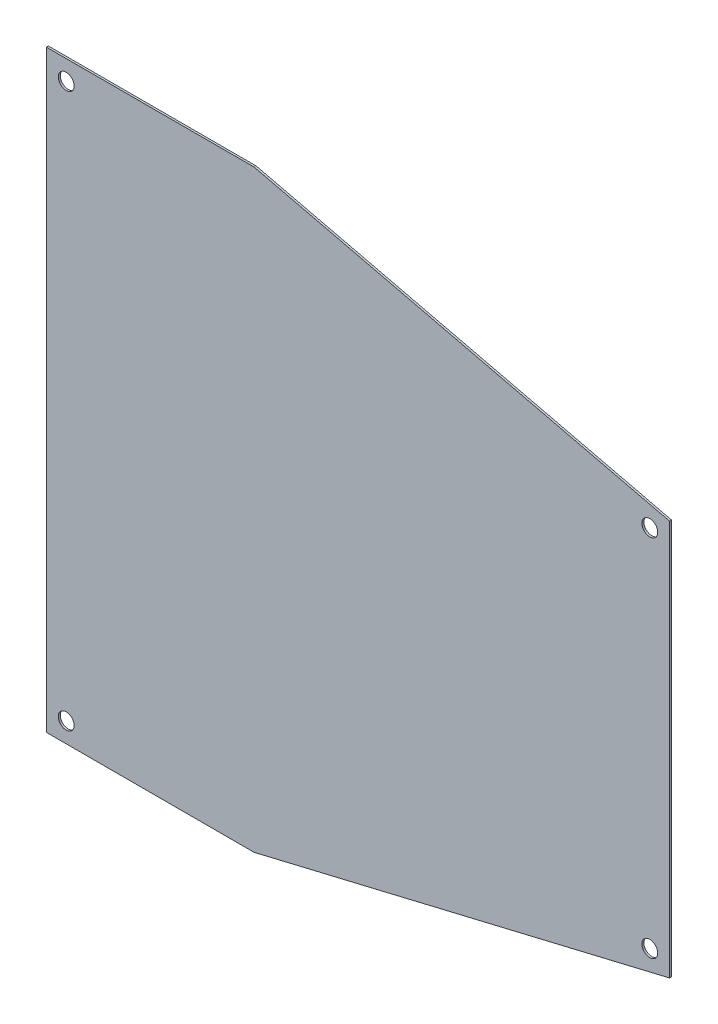
ISO-10303-21;
HEADER;
FILE_DESCRIPTION(('STEP AP214'),'2;1');
FILE_NAME('part.step','',(''),(''),'','','');
FILE_SCHEMA(('AUTOMOTIVE_DESIGN { 1 0 10303 214 1 1 1 1 }'));
ENDSEC;
DATA;
#1=APPLICATION_CONTEXT('core data for automotive mechanical design processes');
#2=APPLICATION_PROTOCOL_DEFINITION('international standard','automotive_design',2000,#1);
#3=PRODUCT_CONTEXT('',#1,'mechanical');
#4=PRODUCT('Part','Part','',(#3));
#5=PRODUCT_RELATED_PRODUCT_CATEGORY('part','',(#4));
#6=PRODUCT_DEFINITION_FORMATION('','',#4);
#7=PRODUCT_DEFINITION_CONTEXT('part definition',#1,'design');
#8=PRODUCT_DEFINITION('design','',#6,#7);
#9=PRODUCT_DEFINITION_SHAPE('','',#8);
#10=(LENGTH_UNIT() NAMED_UNIT(*) SI_UNIT(.MILLI.,.METRE.));
#11=(NAMED_UNIT(*) PLANE_ANGLE_UNIT() SI_UNIT($,.RADIAN.));
#12=(NAMED_UNIT(*) SI_UNIT($,.STERADIAN.) SOLID_ANGLE_UNIT());
#13=UNCERTAINTY_MEASURE_WITH_UNIT(LENGTH_MEASURE(1.E-05),#10,'distance_accuracy_value','');
#14=(GEOMETRIC_REPRESENTATION_CONTEXT(3) GLOBAL_UNCERTAINTY_ASSIGNED_CONTEXT((#13)) GLOBAL_UNIT_ASSIGNED_CONTEXT((#10,
#11,#12)) REPRESENTATION_CONTEXT('',''));
#15=CARTESIAN_POINT('',(0.,0.,0.));
#16=DIRECTION('',(0.,0.,1.));
#17=DIRECTION('',(1.,0.,0.));
#18=AXIS2_PLACEMENT_3D('',#15,#16,#17);
#19=CARTESIAN_POINT('',(210.,0.,0.5));
#20=DIRECTION('',(-1.,0.,0.));
#21=DIRECTION('',(0.,0.,1.));
#22=AXIS2_PLACEMENT_3D('',#19,#20,#21);
#23=PLANE('',#22);
#24=DIRECTION('',(0.,1.,0.));
#25=VECTOR('',#24,1.);
#26=CARTESIAN_POINT('',(210.,0.,0.));
#27=LINE('',#26,#25);
#28=CARTESIAN_POINT('',(210.,-50.,0.));
#29=VERTEX_POINT('',#28);
#30=CARTESIAN_POINT('',(210.,50.,0.));
#31=VERTEX_POINT('',#30);
#32=EDGE_CURVE('E145',#29,#31,#27,.T.);
#33=ORIENTED_EDGE('',*,*,#32,.T.);
#34=DIRECTION('',(0.,0.,-1.));
#35=VECTOR('',#34,1.);
#36=CARTESIAN_POINT('',(210.,50.,0.5));
#37=LINE('',#36,#35);
#38=CARTESIAN_POINT('',(210.,50.,0.5));
#39=VERTEX_POINT('',#38);
#40=EDGE_CURVE('E12',#39,#31,#37,.T.);
#41=ORIENTED_EDGE('',*,*,#40,.F.);
#42=DIRECTION('',(0.,1.,0.));
#43=VECTOR('',#42,1.);
#44=CARTESIAN_POINT('',(210.,0.,0.5));
#45=LINE('',#44,#43);
#46=CARTESIAN_POINT('',(210.,-50.,0.5));
#47=VERTEX_POINT('',#46);
#48=EDGE_CURVE('E169',#47,#39,#45,.T.);
#49=ORIENTED_EDGE('',*,*,#48,.F.);
#50=DIRECTION('',(0.,0.,-1.));
#51=VECTOR('',#50,1.);
#52=CARTESIAN_POINT('',(210.,-50.,0.5));
#53=LINE('',#52,#51);
#54=EDGE_CURVE('E144',#47,#29,#53,.T.);
#55=ORIENTED_EDGE('',*,*,#54,.T.);
#56=EDGE_LOOP('',(#33,#41,#49,#55));
#57=FACE_BOUND('',#56,.T.);
#58=ADVANCED_FACE('F38',(#57),#23,.F.);
#59=CARTESIAN_POINT('',(22.5321888412017,94.6351931330472,0.5));
#60=DIRECTION('',(-0.23162052730604,-0.972806214685367,0.));
#61=DIRECTION('',(0.972806214685367,-0.23162052730604,0.));
#62=AXIS2_PLACEMENT_3D('',#59,#60,#61);
#63=PLANE('',#62);
#64=DIRECTION('',(-0.972806214685367,0.23162052730604,0.));
#65=VECTOR('',#64,1.);
#66=CARTESIAN_POINT('',(22.5321888412017,94.6351931330472,0.));
#67=LINE('',#66,#65);
#68=CARTESIAN_POINT('',(105.,75.,0.));
#69=VERTEX_POINT('',#68);
#70=EDGE_CURVE('E148',#31,#69,#67,.T.);
#71=ORIENTED_EDGE('',*,*,#70,.T.);
#72=DIRECTION('',(0.,0.,-1.));
#73=VECTOR('',#72,1.);
#74=CARTESIAN_POINT('',(105.,75.,0.5));
#75=LINE('',#74,#73);
#76=CARTESIAN_POINT('',(105.,75.,0.5));
#77=VERTEX_POINT('',#76);
#78=EDGE_CURVE('E46',#77,#69,#75,.T.);
#79=ORIENTED_EDGE('',*,*,#78,.F.);
#80=DIRECTION('',(-0.972806214685367,0.23162052730604,0.));
#81=VECTOR('',#80,1.);
#82=CARTESIAN_POINT('',(22.5321888412017,94.6351931330472,0.5));
#83=LINE('',#82,#81);
#84=EDGE_CURVE('E91',#39,#77,#83,.T.);
#85=ORIENTED_EDGE('',*,*,#84,.F.);
#86=ORIENTED_EDGE('',*,*,#40,.T.);
#87=EDGE_LOOP('',(#71,#79,#85,#86));
#88=FACE_BOUND('',#87,.T.);
#89=ADVANCED_FACE('F175',(#88),#63,.F.);
#90=CARTESIAN_POINT('',(0.,75.,0.5));
#91=DIRECTION('',(0.,1.,0.));
#92=DIRECTION('',(0.,0.,1.));
#93=AXIS2_PLACEMENT_3D('',#90,#91,#92);
#94=PLANE('',#93);
#95=DIRECTION('',(1.,0.,0.));
#96=VECTOR('',#95,1.);
#97=CARTESIAN_POINT('',(0.,75.,0.));
#98=LINE('',#97,#96);
#99=CARTESIAN_POINT('',(52.5,75.,0.));
#100=VERTEX_POINT('',#99);
#101=EDGE_CURVE('E151',#100,#69,#98,.T.);
#102=ORIENTED_EDGE('',*,*,#101,.F.);
#103=DIRECTION('',(0.,0.,-1.));
#104=VECTOR('',#103,1.);
#105=CARTESIAN_POINT('',(52.5,75.,0.5));
#106=LINE('',#105,#104);
#107=CARTESIAN_POINT('',(52.5,75.,0.5));
#108=VERTEX_POINT('',#107);
#109=EDGE_CURVE('E114',#108,#100,#106,.T.);
#110=ORIENTED_EDGE('',*,*,#109,.F.);
#111=DIRECTION('',(1.,0.,0.));
#112=VECTOR('',#111,1.);
#113=CARTESIAN_POINT('',(0.,75.,0.5));
#114=LINE('',#113,#112);
#115=EDGE_CURVE('E106',#108,#77,#114,.T.);
#116=ORIENTED_EDGE('',*,*,#115,.T.);
#117=ORIENTED_EDGE('',*,*,#78,.T.);
#118=EDGE_LOOP('',(#102,#110,#116,#117));
#119=FACE_BOUND('',#118,.T.);
#120=ADVANCED_FACE('F174',(#119),#94,.T.);
#121=CARTESIAN_POINT('',(52.5,0.,0.5));
#122=DIRECTION('',(1.,0.,0.));
#123=DIRECTION('',(0.,1.,0.));
#124=AXIS2_PLACEMENT_3D('',#121,#122,#123);
#125=PLANE('',#124);
#126=DIRECTION('',(0.,-1.,0.));
#127=VECTOR('',#126,1.);
#128=CARTESIAN_POINT('',(52.5,0.,0.));
#129=LINE('',#128,#127);
#130=CARTESIAN_POINT('',(52.5000000000001,-75.,0.));
#131=VERTEX_POINT('',#130);
#132=EDGE_CURVE('E113',#100,#131,#129,.T.);
#133=ORIENTED_EDGE('',*,*,#132,.T.);
#134=DIRECTION('',(0.,0.,-1.));
#135=VECTOR('',#134,1.);
#136=CARTESIAN_POINT('',(52.5000000000001,-75.,0.5));
#137=LINE('',#136,#135);
#138=CARTESIAN_POINT('',(52.5000000000001,-75.,0.5));
#139=VERTEX_POINT('',#138);
#140=EDGE_CURVE('E110',#139,#131,#137,.T.);
#141=ORIENTED_EDGE('',*,*,#140,.F.);
#142=DIRECTION('',(0.,-1.,0.));
#143=VECTOR('',#142,1.);
#144=CARTESIAN_POINT('',(52.5,0.,0.5));
#145=LINE('',#144,#143);
#146=EDGE_CURVE('E99',#108,#139,#145,.T.);
#147=ORIENTED_EDGE('',*,*,#146,.F.);
#148=ORIENTED_EDGE('',*,*,#109,.T.);
#149=EDGE_LOOP('',(#133,#141,#147,#148));
#150=FACE_BOUND('',#149,.T.);
#151=ADVANCED_FACE('F111',(#150),#125,.F.);
#152=CARTESIAN_POINT('',(0.,-75.,0.5));
#153=DIRECTION('',(0.,1.,0.));
#154=DIRECTION('',(0.,0.,1.));
#155=AXIS2_PLACEMENT_3D('',#152,#153,#154);
#156=PLANE('',#155);
#157=DIRECTION('',(1.,0.,0.));
#158=VECTOR('',#157,1.);
#159=CARTESIAN_POINT('',(0.,-75.,0.));
#160=LINE('',#159,#158);
#161=CARTESIAN_POINT('',(105.,-75.,0.));
#162=VERTEX_POINT('',#161);
#163=EDGE_CURVE('E77',#131,#162,#160,.T.);
#164=ORIENTED_EDGE('',*,*,#163,.T.);
#165=DIRECTION('',(0.,0.,-1.));
#166=VECTOR('',#165,1.);
#167=CARTESIAN_POINT('',(105.,-75.,0.5));
#168=LINE('',#167,#166);
#169=CARTESIAN_POINT('',(105.,-75.,0.5));
#170=VERTEX_POINT('',#169);
#171=EDGE_CURVE('E115',#170,#162,#168,.T.);
#172=ORIENTED_EDGE('',*,*,#171,.F.);
#173=DIRECTION('',(1.,0.,0.));
#174=VECTOR('',#173,1.);
#175=CARTESIAN_POINT('',(0.,-75.,0.5));
#176=LINE('',#175,#174);
#177=EDGE_CURVE('E104',#139,#170,#176,.T.);
#178=ORIENTED_EDGE('',*,*,#177,.F.);
#179=ORIENTED_EDGE('',*,*,#140,.T.);
#180=EDGE_LOOP('',(#164,#172,#178,#179));
#181=FACE_BOUND('',#180,.T.);
#182=ADVANCED_FACE('F117',(#181),#156,.F.);
#183=CARTESIAN_POINT('',(57.5,70.,0.5));
#184=DIRECTION('',(0.,0.,-1.));
#185=DIRECTION('',(-1.,0.,0.));
#186=AXIS2_PLACEMENT_3D('',#183,#184,#185);
#187=CYLINDRICAL_SURFACE('',#186,2.);
#188=CARTESIAN_POINT('',(57.5,70.,0.5));
#189=DIRECTION('',(0.,0.,1.));
#190=DIRECTION('',(1.,0.,0.));
#191=AXIS2_PLACEMENT_3D('',#188,#189,#190);
#192=CIRCLE('',#191,2.);
#193=CARTESIAN_POINT('',(59.5,70.,0.5));
#194=VERTEX_POINT('',#193);
#195=EDGE_CURVE('E133',#194,#194,#192,.T.);
#196=ORIENTED_EDGE('',*,*,#195,.T.);
#197=EDGE_LOOP('',(#196));
#198=FACE_BOUND('',#197,.T.);
#199=CARTESIAN_POINT('',(57.5,70.,0.));
#200=DIRECTION('',(0.,0.,1.));
#201=DIRECTION('',(1.,0.,0.));
#202=AXIS2_PLACEMENT_3D('',#199,#200,#201);
#203=CIRCLE('',#202,2.);
#204=CARTESIAN_POINT('',(59.5,70.,0.));
#205=VERTEX_POINT('',#204);
#206=EDGE_CURVE('E163',#205,#205,#203,.T.);
#207=ORIENTED_EDGE('',*,*,#206,.F.);
#208=EDGE_LOOP('',(#207));
#209=FACE_BOUND('',#208,.T.);
#210=ADVANCED_FACE('F209',(#198,#209),#187,.F.);
#211=CARTESIAN_POINT('',(57.5,-70.,0.5));
#212=DIRECTION('',(0.,0.,-1.));
#213=DIRECTION('',(-1.,0.,0.));
#214=AXIS2_PLACEMENT_3D('',#211,#212,#213);
#215=CYLINDRICAL_SURFACE('',#214,2.);
#216=CARTESIAN_POINT('',(57.5,-70.,0.5));
#217=DIRECTION('',(0.,0.,1.));
#218=DIRECTION('',(1.,0.,0.));
#219=AXIS2_PLACEMENT_3D('',#216,#217,#218);
#220=CIRCLE('',#219,2.);
#221=CARTESIAN_POINT('',(59.5,-70.,0.5));
#222=VERTEX_POINT('',#221);
#223=EDGE_CURVE('E139',#222,#222,#220,.F.);
#224=ORIENTED_EDGE('',*,*,#223,.F.);
#225=EDGE_LOOP('',(#224));
#226=FACE_BOUND('',#225,.T.);
#227=CARTESIAN_POINT('',(57.5,-70.,0.));
#228=DIRECTION('',(0.,0.,1.));
#229=DIRECTION('',(1.,0.,0.));
#230=AXIS2_PLACEMENT_3D('',#227,#228,#229);
#231=CIRCLE('',#230,2.);
#232=CARTESIAN_POINT('',(59.5,-70.,0.));
#233=VERTEX_POINT('',#232);
#234=EDGE_CURVE('E160',#233,#233,#231,.F.);
#235=ORIENTED_EDGE('',*,*,#234,.T.);
#236=EDGE_LOOP('',(#235));
#237=FACE_BOUND('',#236,.T.);
#238=ADVANCED_FACE('F194',(#226,#237),#215,.F.);
#239=CARTESIAN_POINT('',(205.,-46.050706394066,0.5));
#240=DIRECTION('',(0.,0.,-1.));
#241=DIRECTION('',(-1.,0.,0.));
#242=AXIS2_PLACEMENT_3D('',#239,#240,#241);
#243=CYLINDRICAL_SURFACE('',#242,2.);
#244=CARTESIAN_POINT('',(205.,-46.050706394066,0.5));
#245=DIRECTION('',(0.,0.,1.));
#246=DIRECTION('',(1.,0.,0.));
#247=AXIS2_PLACEMENT_3D('',#244,#245,#246);
#248=CIRCLE('',#247,2.);
#249=CARTESIAN_POINT('',(207.,-46.050706394066,0.5));
#250=VERTEX_POINT('',#249);
#251=EDGE_CURVE('E121',#250,#250,#248,.F.);
#252=ORIENTED_EDGE('',*,*,#251,.F.);
#253=EDGE_LOOP('',(#252));
#254=FACE_BOUND('',#253,.T.);
#255=CARTESIAN_POINT('',(205.,-46.050706394066,0.));
#256=DIRECTION('',(0.,0.,1.));
#257=DIRECTION('',(1.,0.,0.));
#258=AXIS2_PLACEMENT_3D('',#255,#256,#257);
#259=CIRCLE('',#258,2.);
#260=CARTESIAN_POINT('',(207.,-46.050706394066,0.));
#261=VERTEX_POINT('',#260);
#262=EDGE_CURVE('E157',#261,#261,#259,.F.);
#263=ORIENTED_EDGE('',*,*,#262,.T.);
#264=EDGE_LOOP('',(#263));
#265=FACE_BOUND('',#264,.T.);
#266=ADVANCED_FACE('F186',(#254,#265),#243,.F.);
#267=CARTESIAN_POINT('',(22.5321888412017,-94.6351931330472,0.5));
#268=DIRECTION('',(-0.23162052730604,0.972806214685367,0.));
#269=DIRECTION('',(-0.972806214685367,-0.23162052730604,0.));
#270=AXIS2_PLACEMENT_3D('',#267,#268,#269);
#271=PLANE('',#270);
#272=DIRECTION('',(0.972806214685367,0.23162052730604,0.));
#273=VECTOR('',#272,1.);
#274=CARTESIAN_POINT('',(22.5321888412017,-94.6351931330472,0.));
#275=LINE('',#274,#273);
#276=EDGE_CURVE('E83',#162,#29,#275,.T.);
#277=ORIENTED_EDGE('',*,*,#276,.T.);
#278=ORIENTED_EDGE('',*,*,#54,.F.);
#279=DIRECTION('',(0.972806214685367,0.23162052730604,0.));
#280=VECTOR('',#279,1.);
#281=CARTESIAN_POINT('',(22.5321888412017,-94.6351931330472,0.5));
#282=LINE('',#281,#280);
#283=EDGE_CURVE('E54',#170,#47,#282,.T.);
#284=ORIENTED_EDGE('',*,*,#283,.F.);
#285=ORIENTED_EDGE('',*,*,#171,.T.);
#286=EDGE_LOOP('',(#277,#278,#284,#285));
#287=FACE_BOUND('',#286,.T.);
#288=ADVANCED_FACE('F183',(#287),#271,.F.);
#289=CARTESIAN_POINT('',(205.,46.050706394066,0.5));
#290=DIRECTION('',(0.,0.,-1.));
#291=DIRECTION('',(-1.,0.,0.));
#292=AXIS2_PLACEMENT_3D('',#289,#290,#291);
#293=CYLINDRICAL_SURFACE('',#292,2.);
#294=CARTESIAN_POINT('',(205.,46.050706394066,0.5));
#295=DIRECTION('',(0.,0.,1.));
#296=DIRECTION('',(1.,0.,0.));
#297=AXIS2_PLACEMENT_3D('',#294,#295,#296);
#298=CIRCLE('',#297,2.);
#299=CARTESIAN_POINT('',(207.,46.050706394066,0.5));
#300=VERTEX_POINT('',#299);
#301=EDGE_CURVE('E138',#300,#300,#298,.T.);
#302=ORIENTED_EDGE('',*,*,#301,.T.);
#303=EDGE_LOOP('',(#302));
#304=FACE_BOUND('',#303,.T.);
#305=CARTESIAN_POINT('',(205.,46.050706394066,0.));
#306=DIRECTION('',(0.,0.,1.));
#307=DIRECTION('',(1.,0.,0.));
#308=AXIS2_PLACEMENT_3D('',#305,#306,#307);
#309=CIRCLE('',#308,2.);
#310=CARTESIAN_POINT('',(207.,46.050706394066,0.));
#311=VERTEX_POINT('',#310);
#312=EDGE_CURVE('E166',#311,#311,#309,.T.);
#313=ORIENTED_EDGE('',*,*,#312,.F.);
#314=EDGE_LOOP('',(#313));
#315=FACE_BOUND('',#314,.T.);
#316=ADVANCED_FACE('F185',(#304,#315),#293,.F.);
#317=CARTESIAN_POINT('',(0.,0.,0.5));
#318=DIRECTION('',(0.,0.,1.));
#319=DIRECTION('',(1.,0.,0.));
#320=AXIS2_PLACEMENT_3D('',#317,#318,#319);
#321=PLANE('',#320);
#322=ORIENTED_EDGE('',*,*,#48,.T.);
#323=ORIENTED_EDGE('',*,*,#84,.T.);
#324=ORIENTED_EDGE('',*,*,#115,.F.);
#325=ORIENTED_EDGE('',*,*,#146,.T.);
#326=ORIENTED_EDGE('',*,*,#177,.T.);
#327=ORIENTED_EDGE('',*,*,#283,.T.);
#328=EDGE_LOOP('',(#322,#323,#324,#325,#326,#327));
#329=FACE_BOUND('',#328,.T.);
#330=ORIENTED_EDGE('',*,*,#251,.T.);
#331=EDGE_LOOP('',(#330));
#332=FACE_BOUND('',#331,.T.);
#333=ORIENTED_EDGE('',*,*,#223,.T.);
#334=EDGE_LOOP('',(#333));
#335=FACE_BOUND('',#334,.T.);
#336=ORIENTED_EDGE('',*,*,#195,.F.);
#337=EDGE_LOOP('',(#336));
#338=FACE_BOUND('',#337,.T.);
#339=ORIENTED_EDGE('',*,*,#301,.F.);
#340=EDGE_LOOP('',(#339));
#341=FACE_BOUND('',#340,.T.);
#342=ADVANCED_FACE('F101',(#329,#332,#335,#338,#341),#321,.T.);
#343=CARTESIAN_POINT('',(0.,0.,0.));
#344=DIRECTION('',(0.,0.,1.));
#345=DIRECTION('',(1.,0.,0.));
#346=AXIS2_PLACEMENT_3D('',#343,#344,#345);
#347=PLANE('',#346);
#348=ORIENTED_EDGE('',*,*,#32,.F.);
#349=ORIENTED_EDGE('',*,*,#276,.F.);
#350=ORIENTED_EDGE('',*,*,#163,.F.);
#351=ORIENTED_EDGE('',*,*,#132,.F.);
#352=ORIENTED_EDGE('',*,*,#101,.T.);
#353=ORIENTED_EDGE('',*,*,#70,.F.);
#354=EDGE_LOOP('',(#348,#349,#350,#351,#352,#353));
#355=FACE_BOUND('',#354,.T.);
#356=ORIENTED_EDGE('',*,*,#262,.F.);
#357=EDGE_LOOP('',(#356));
#358=FACE_BOUND('',#357,.T.);
#359=ORIENTED_EDGE('',*,*,#234,.F.);
#360=EDGE_LOOP('',(#359));
#361=FACE_BOUND('',#360,.T.);
#362=ORIENTED_EDGE('',*,*,#206,.T.);
#363=EDGE_LOOP('',(#362));
#364=FACE_BOUND('',#363,.T.);
#365=ORIENTED_EDGE('',*,*,#312,.T.);
#366=EDGE_LOOP('',(#365));
#367=FACE_BOUND('',#366,.T.);
#368=ADVANCED_FACE('F179',(#355,#358,#361,#364,#367),#347,.F.);
#369=CLOSED_SHELL('',(#58,#89,#120,#151,#182,#210,#238,#266,#288,#316,#342,#368));
#370=MANIFOLD_SOLID_BREP('B2',#369);
#371=ADVANCED_BREP_SHAPE_REPRESENTATION('',(#18,#370),#14);
#372=SHAPE_DEFINITION_REPRESENTATION(#9,#371);
ENDSEC;
END-ISO-10303-21;
